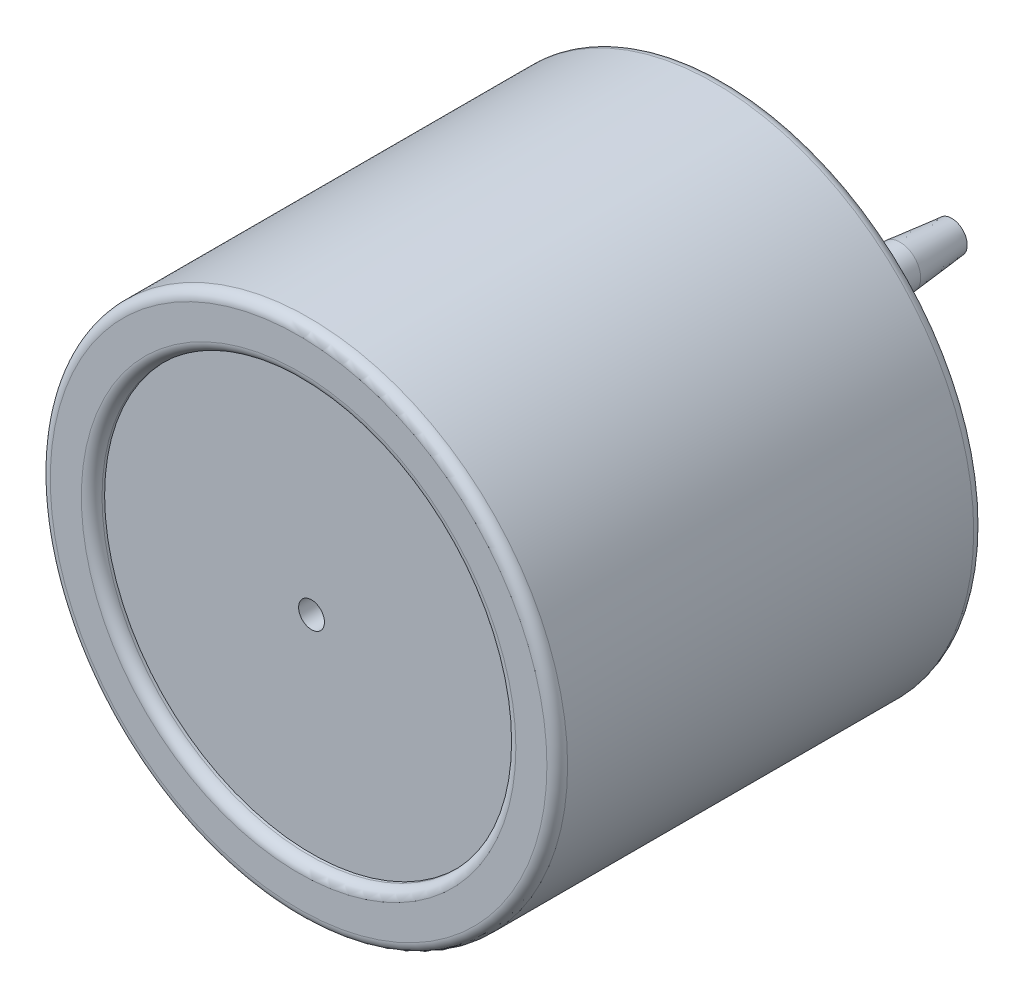
ISO-10303-21;
HEADER;
FILE_DESCRIPTION(('STEP AP214'),'2;1');
FILE_NAME('part.step','',(''),(''),'','','');
FILE_SCHEMA(('AUTOMOTIVE_DESIGN { 1 0 10303 214 1 1 1 1 }'));
ENDSEC;
DATA;
#1=APPLICATION_CONTEXT('core data for automotive mechanical design processes');
#2=APPLICATION_PROTOCOL_DEFINITION('international standard','automotive_design',2000,#1);
#3=PRODUCT_CONTEXT('',#1,'mechanical');
#4=PRODUCT('Part','Part','',(#3));
#5=PRODUCT_RELATED_PRODUCT_CATEGORY('part','',(#4));
#6=PRODUCT_DEFINITION_FORMATION('','',#4);
#7=PRODUCT_DEFINITION_CONTEXT('part definition',#1,'design');
#8=PRODUCT_DEFINITION('design','',#6,#7);
#9=PRODUCT_DEFINITION_SHAPE('','',#8);
#10=(LENGTH_UNIT() NAMED_UNIT(*) SI_UNIT(.MILLI.,.METRE.));
#11=(NAMED_UNIT(*) PLANE_ANGLE_UNIT() SI_UNIT($,.RADIAN.));
#12=(NAMED_UNIT(*) SI_UNIT($,.STERADIAN.) SOLID_ANGLE_UNIT());
#13=UNCERTAINTY_MEASURE_WITH_UNIT(LENGTH_MEASURE(1.E-05),#10,'distance_accuracy_value','');
#14=(GEOMETRIC_REPRESENTATION_CONTEXT(3) GLOBAL_UNCERTAINTY_ASSIGNED_CONTEXT((#13)) GLOBAL_UNIT_ASSIGNED_CONTEXT((#10,
#11,#12)) REPRESENTATION_CONTEXT('',''));
#15=CARTESIAN_POINT('',(0.,0.,0.));
#16=DIRECTION('',(0.,0.,1.));
#17=DIRECTION('',(1.,0.,0.));
#18=AXIS2_PLACEMENT_3D('',#15,#16,#17);
#19=CARTESIAN_POINT('',(0.,0.,16.5));
#20=DIRECTION('',(0.,0.,-1.));
#21=DIRECTION('',(-1.,0.,0.));
#22=AXIS2_PLACEMENT_3D('',#19,#20,#21);
#23=CYLINDRICAL_SURFACE('',#22,10.);
#24=CARTESIAN_POINT('',(0.,0.,0.400000000000001));
#25=DIRECTION('',(0.,0.,1.));
#26=DIRECTION('',(1.,0.,0.));
#27=AXIS2_PLACEMENT_3D('',#24,#25,#26);
#28=CIRCLE('',#27,10.);
#29=CARTESIAN_POINT('',(10.,0.,0.400000000000001));
#30=VERTEX_POINT('',#29);
#31=EDGE_CURVE('E75',#30,#30,#28,.T.);
#32=ORIENTED_EDGE('',*,*,#31,.T.);
#33=EDGE_LOOP('',(#32));
#34=FACE_BOUND('',#33,.T.);
#35=CARTESIAN_POINT('',(0.,0.,16.1));
#36=DIRECTION('',(0.,0.,1.));
#37=DIRECTION('',(1.,0.,0.));
#38=AXIS2_PLACEMENT_3D('',#35,#36,#37);
#39=CIRCLE('',#38,10.);
#40=CARTESIAN_POINT('',(10.,0.,16.1));
#41=VERTEX_POINT('',#40);
#42=EDGE_CURVE('E79',#41,#41,#39,.F.);
#43=ORIENTED_EDGE('',*,*,#42,.T.);
#44=EDGE_LOOP('',(#43));
#45=FACE_BOUND('',#44,.T.);
#46=ADVANCED_FACE('F43',(#34,#45),#23,.T.);
#47=CARTESIAN_POINT('',(0.,0.,16.5));
#48=DIRECTION('',(0.,0.,1.));
#49=DIRECTION('',(1.,0.,0.));
#50=AXIS2_PLACEMENT_3D('',#47,#48,#49);
#51=PLANE('',#50);
#52=CARTESIAN_POINT('',(0.,0.,16.5));
#53=DIRECTION('',(0.,0.,1.));
#54=DIRECTION('',(1.,0.,0.));
#55=AXIS2_PLACEMENT_3D('',#52,#53,#54);
#56=CIRCLE('',#55,9.6);
#57=CARTESIAN_POINT('',(9.6,0.,16.5));
#58=VERTEX_POINT('',#57);
#59=EDGE_CURVE('E51',#58,#58,#56,.T.);
#60=ORIENTED_EDGE('',*,*,#59,.T.);
#61=EDGE_LOOP('',(#60));
#62=FACE_BOUND('',#61,.T.);
#63=CARTESIAN_POINT('',(0.,0.,16.5));
#64=DIRECTION('',(0.,0.,1.));
#65=DIRECTION('',(1.,0.,0.));
#66=AXIS2_PLACEMENT_3D('',#63,#64,#65);
#67=CIRCLE('',#66,8.4);
#68=CARTESIAN_POINT('',(8.4,0.,16.5));
#69=VERTEX_POINT('',#68);
#70=EDGE_CURVE('E56',#69,#69,#67,.F.);
#71=ORIENTED_EDGE('',*,*,#70,.T.);
#72=EDGE_LOOP('',(#71));
#73=FACE_BOUND('',#72,.T.);
#74=ADVANCED_FACE('F148',(#62,#73),#51,.T.);
#75=CARTESIAN_POINT('',(0.,0.,0.));
#76=DIRECTION('',(0.,0.,1.));
#77=DIRECTION('',(1.,0.,0.));
#78=AXIS2_PLACEMENT_3D('',#75,#76,#77);
#79=PLANE('',#78);
#80=CARTESIAN_POINT('',(0.,0.,0.));
#81=DIRECTION('',(0.,0.,1.));
#82=DIRECTION('',(1.,0.,0.));
#83=AXIS2_PLACEMENT_3D('',#80,#81,#82);
#84=CIRCLE('',#83,9.6);
#85=CARTESIAN_POINT('',(9.6,0.,0.));
#86=VERTEX_POINT('',#85);
#87=EDGE_CURVE('E67',#86,#86,#84,.F.);
#88=ORIENTED_EDGE('',*,*,#87,.T.);
#89=EDGE_LOOP('',(#88));
#90=FACE_BOUND('',#89,.T.);
#91=CARTESIAN_POINT('',(0.,0.,0.));
#92=DIRECTION('',(0.,0.,1.));
#93=DIRECTION('',(1.,0.,0.));
#94=AXIS2_PLACEMENT_3D('',#91,#92,#93);
#95=CIRCLE('',#94,9.15);
#96=CARTESIAN_POINT('',(9.15,0.,0.));
#97=VERTEX_POINT('',#96);
#98=EDGE_CURVE('E71',#97,#97,#95,.T.);
#99=ORIENTED_EDGE('',*,*,#98,.T.);
#100=EDGE_LOOP('',(#99));
#101=FACE_BOUND('',#100,.T.);
#102=ADVANCED_FACE('F155',(#90,#101),#79,.F.);
#103=CARTESIAN_POINT('',(0.,0.,16.));
#104=DIRECTION('',(0.,0.,1.));
#105=DIRECTION('',(1.,0.,0.));
#106=AXIS2_PLACEMENT_3D('',#103,#104,#105);
#107=PLANE('',#106);
#108=CARTESIAN_POINT('',(0.,0.,16.));
#109=DIRECTION('',(0.,0.,1.));
#110=DIRECTION('',(1.,0.,0.));
#111=AXIS2_PLACEMENT_3D('',#108,#109,#110);
#112=CIRCLE('',#111,8.);
#113=CARTESIAN_POINT('',(8.,0.,16.));
#114=VERTEX_POINT('',#113);
#115=EDGE_CURVE('E104',#114,#114,#112,.T.);
#116=ORIENTED_EDGE('',*,*,#115,.T.);
#117=EDGE_LOOP('',(#116));
#118=FACE_BOUND('',#117,.T.);
#119=CARTESIAN_POINT('',(0.,0.,16.));
#120=DIRECTION('',(0.,0.,1.));
#121=DIRECTION('',(1.,0.,0.));
#122=AXIS2_PLACEMENT_3D('',#119,#120,#121);
#123=CIRCLE('',#122,0.5);
#124=CARTESIAN_POINT('',(0.5,0.,16.));
#125=VERTEX_POINT('',#124);
#126=EDGE_CURVE('E100',#125,#125,#123,.F.);
#127=ORIENTED_EDGE('',*,*,#126,.T.);
#128=EDGE_LOOP('',(#127));
#129=FACE_BOUND('',#128,.T.);
#130=ADVANCED_FACE('F233',(#118,#129),#107,.T.);
#131=CARTESIAN_POINT('',(0.,0.,16.));
#132=DIRECTION('',(0.,0.,1.));
#133=DIRECTION('',(1.,0.,0.));
#134=AXIS2_PLACEMENT_3D('',#131,#132,#133);
#135=CYLINDRICAL_SURFACE('',#134,8.);
#136=CARTESIAN_POINT('',(0.,0.,16.1));
#137=DIRECTION('',(0.,0.,1.));
#138=DIRECTION('',(1.,0.,0.));
#139=AXIS2_PLACEMENT_3D('',#136,#137,#138);
#140=CIRCLE('',#139,8.);
#141=CARTESIAN_POINT('',(8.,0.,16.1));
#142=VERTEX_POINT('',#141);
#143=EDGE_CURVE('E10',#142,#142,#140,.T.);
#144=ORIENTED_EDGE('',*,*,#143,.T.);
#145=EDGE_LOOP('',(#144));
#146=FACE_BOUND('',#145,.T.);
#147=ORIENTED_EDGE('',*,*,#115,.F.);
#148=EDGE_LOOP('',(#147));
#149=FACE_BOUND('',#148,.T.);
#150=ADVANCED_FACE('F229',(#146,#149),#135,.F.);
#151=CARTESIAN_POINT('',(0.,0.,10.5));
#152=DIRECTION('',(0.,0.,1.));
#153=DIRECTION('',(1.,0.,0.));
#154=AXIS2_PLACEMENT_3D('',#151,#152,#153);
#155=PLANE('',#154);
#156=CARTESIAN_POINT('',(0.,0.,10.5));
#157=DIRECTION('',(0.,0.,1.));
#158=DIRECTION('',(1.,0.,0.));
#159=AXIS2_PLACEMENT_3D('',#156,#157,#158);
#160=CIRCLE('',#159,0.5);
#161=CARTESIAN_POINT('',(0.5,0.,10.5));
#162=VERTEX_POINT('',#161);
#163=EDGE_CURVE('E99',#162,#162,#160,.T.);
#164=ORIENTED_EDGE('',*,*,#163,.T.);
#165=EDGE_LOOP('',(#164));
#166=FACE_BOUND('',#165,.T.);
#167=ADVANCED_FACE('F143',(#166),#155,.T.);
#168=CARTESIAN_POINT('',(0.,0.,10.5));
#169=DIRECTION('',(0.,0.,1.));
#170=DIRECTION('',(1.,0.,0.));
#171=AXIS2_PLACEMENT_3D('',#168,#169,#170);
#172=CYLINDRICAL_SURFACE('',#171,0.5);
#173=ORIENTED_EDGE('',*,*,#163,.F.);
#174=EDGE_LOOP('',(#173));
#175=FACE_BOUND('',#174,.T.);
#176=ORIENTED_EDGE('',*,*,#126,.F.);
#177=EDGE_LOOP('',(#176));
#178=FACE_BOUND('',#177,.T.);
#179=ADVANCED_FACE('F137',(#175,#178),#172,.F.);
#180=CARTESIAN_POINT('',(0.,0.,0.8));
#181=DIRECTION('',(0.,0.,-1.));
#182=DIRECTION('',(-1.,0.,0.));
#183=AXIS2_PLACEMENT_3D('',#180,#181,#182);
#184=CYLINDRICAL_SURFACE('',#183,8.75);
#185=CARTESIAN_POINT('',(0.,0.,0.4));
#186=DIRECTION('',(0.,0.,1.));
#187=DIRECTION('',(1.,0.,0.));
#188=AXIS2_PLACEMENT_3D('',#185,#186,#187);
#189=CIRCLE('',#188,8.75);
#190=CARTESIAN_POINT('',(8.75,0.,0.4));
#191=VERTEX_POINT('',#190);
#192=EDGE_CURVE('E61',#191,#191,#189,.F.);
#193=ORIENTED_EDGE('',*,*,#192,.T.);
#194=EDGE_LOOP('',(#193));
#195=FACE_BOUND('',#194,.T.);
#196=CARTESIAN_POINT('',(0.,0.,0.8));
#197=DIRECTION('',(0.,0.,-1.));
#198=DIRECTION('',(-1.,0.,0.));
#199=AXIS2_PLACEMENT_3D('',#196,#197,#198);
#200=CIRCLE('',#199,8.75);
#201=CARTESIAN_POINT('',(-8.75,0.,0.8));
#202=VERTEX_POINT('',#201);
#203=EDGE_CURVE('E111',#202,#202,#200,.T.);
#204=ORIENTED_EDGE('',*,*,#203,.F.);
#205=EDGE_LOOP('',(#204));
#206=FACE_BOUND('',#205,.T.);
#207=ADVANCED_FACE('F130',(#195,#206),#184,.F.);
#208=CARTESIAN_POINT('',(0.,0.,0.8));
#209=DIRECTION('',(0.,0.,-1.));
#210=DIRECTION('',(-1.,0.,0.));
#211=AXIS2_PLACEMENT_3D('',#208,#209,#210);
#212=PLANE('',#211);
#213=CARTESIAN_POINT('',(-4.7,5.,0.8));
#214=DIRECTION('',(0.,0.,-1.));
#215=DIRECTION('',(1.,0.,0.));
#216=AXIS2_PLACEMENT_3D('',#213,#214,#215);
#217=CIRCLE('',#216,0.800000000000001);
#218=CARTESIAN_POINT('',(-3.9,5.,0.8));
#219=VERTEX_POINT('',#218);
#220=EDGE_CURVE('E119',#219,#219,#217,.T.);
#221=ORIENTED_EDGE('',*,*,#220,.F.);
#222=EDGE_LOOP('',(#221));
#223=FACE_BOUND('',#222,.T.);
#224=CARTESIAN_POINT('',(4.7,5.,0.8));
#225=DIRECTION('',(0.,0.,-1.));
#226=DIRECTION('',(-1.,0.,0.));
#227=AXIS2_PLACEMENT_3D('',#224,#225,#226);
#228=CIRCLE('',#227,0.800000000000001);
#229=CARTESIAN_POINT('',(3.9,5.,0.8));
#230=VERTEX_POINT('',#229);
#231=EDGE_CURVE('E115',#230,#230,#228,.T.);
#232=ORIENTED_EDGE('',*,*,#231,.F.);
#233=EDGE_LOOP('',(#232));
#234=FACE_BOUND('',#233,.T.);
#235=ORIENTED_EDGE('',*,*,#203,.T.);
#236=EDGE_LOOP('',(#235));
#237=FACE_BOUND('',#236,.T.);
#238=ADVANCED_FACE('F126',(#223,#234,#237),#212,.T.);
#239=CARTESIAN_POINT('',(4.7,5.,-4.05));
#240=DIRECTION('',(0.,0.,1.));
#241=DIRECTION('',(1.,0.,0.));
#242=AXIS2_PLACEMENT_3D('',#239,#240,#241);
#243=CYLINDRICAL_SURFACE('',#242,0.800000000000001);
#244=CARTESIAN_POINT('',(4.7,5.,-2.04999999999999));
#245=DIRECTION('',(0.,0.,-1.));
#246=DIRECTION('',(-1.,0.,0.));
#247=AXIS2_PLACEMENT_3D('',#244,#245,#246);
#248=CIRCLE('',#247,0.800000000000001);
#249=CARTESIAN_POINT('',(3.9,5.,-2.04999999999999));
#250=VERTEX_POINT('',#249);
#251=EDGE_CURVE('E83',#250,#250,#248,.F.);
#252=ORIENTED_EDGE('',*,*,#251,.T.);
#253=EDGE_LOOP('',(#252));
#254=FACE_BOUND('',#253,.T.);
#255=ORIENTED_EDGE('',*,*,#231,.T.);
#256=EDGE_LOOP('',(#255));
#257=FACE_BOUND('',#256,.T.);
#258=ADVANCED_FACE('F129',(#254,#257),#243,.T.);
#259=CARTESIAN_POINT('',(4.7,5.,-4.05));
#260=DIRECTION('',(0.,0.,-1.));
#261=DIRECTION('',(-1.,0.,0.));
#262=AXIS2_PLACEMENT_3D('',#259,#260,#261);
#263=PLANE('',#262);
#264=CARTESIAN_POINT('',(4.7,5.,-4.05));
#265=DIRECTION('',(0.,0.,-1.));
#266=DIRECTION('',(-1.,0.,0.));
#267=AXIS2_PLACEMENT_3D('',#264,#265,#266);
#268=CIRCLE('',#267,0.600000000000007);
#269=CARTESIAN_POINT('',(4.09999999999999,5.,-4.05));
#270=VERTEX_POINT('',#269);
#271=EDGE_CURVE('E87',#270,#270,#268,.T.);
#272=ORIENTED_EDGE('',*,*,#271,.T.);
#273=EDGE_LOOP('',(#272));
#274=FACE_BOUND('',#273,.T.);
#275=ADVANCED_FACE('F298',(#274),#263,.T.);
#276=CARTESIAN_POINT('',(-4.7,5.,-4.05));
#277=DIRECTION('',(0.,0.,1.));
#278=DIRECTION('',(1.,0.,0.));
#279=AXIS2_PLACEMENT_3D('',#276,#277,#278);
#280=CYLINDRICAL_SURFACE('',#279,0.800000000000001);
#281=CARTESIAN_POINT('',(-4.7,5.,-2.04999999999999));
#282=DIRECTION('',(0.,0.,1.));
#283=DIRECTION('',(1.,0.,0.));
#284=AXIS2_PLACEMENT_3D('',#281,#282,#283);
#285=CIRCLE('',#284,0.800000000000001);
#286=CARTESIAN_POINT('',(-3.9,5.,-2.04999999999999));
#287=VERTEX_POINT('',#286);
#288=EDGE_CURVE('E91',#287,#287,#285,.T.);
#289=ORIENTED_EDGE('',*,*,#288,.T.);
#290=EDGE_LOOP('',(#289));
#291=FACE_BOUND('',#290,.T.);
#292=ORIENTED_EDGE('',*,*,#220,.T.);
#293=EDGE_LOOP('',(#292));
#294=FACE_BOUND('',#293,.T.);
#295=ADVANCED_FACE('F124',(#291,#294),#280,.T.);
#296=CARTESIAN_POINT('',(-4.7,5.,-4.05));
#297=DIRECTION('',(0.,0.,1.));
#298=DIRECTION('',(1.,0.,0.));
#299=AXIS2_PLACEMENT_3D('',#296,#297,#298);
#300=PLANE('',#299);
#301=CARTESIAN_POINT('',(-4.7,5.,-4.05));
#302=DIRECTION('',(0.,0.,1.));
#303=DIRECTION('',(1.,0.,0.));
#304=AXIS2_PLACEMENT_3D('',#301,#302,#303);
#305=CIRCLE('',#304,0.600000000000007);
#306=CARTESIAN_POINT('',(-4.09999999999999,5.,-4.05));
#307=VERTEX_POINT('',#306);
#308=EDGE_CURVE('E95',#307,#307,#305,.F.);
#309=ORIENTED_EDGE('',*,*,#308,.T.);
#310=EDGE_LOOP('',(#309));
#311=FACE_BOUND('',#310,.T.);
#312=ADVANCED_FACE('F168',(#311),#300,.F.);
#313=CARTESIAN_POINT('',(-4.7,5.,-4.05));
#314=DIRECTION('',(0.,0.,1.));
#315=DIRECTION('',(1.,0.,0.));
#316=AXIS2_PLACEMENT_3D('',#313,#314,#315);
#317=CONICAL_SURFACE('',#316,0.600000000000007,0.0996686524911584);
#318=ORIENTED_EDGE('',*,*,#288,.F.);
#319=EDGE_LOOP('',(#318));
#320=FACE_BOUND('',#319,.T.);
#321=ORIENTED_EDGE('',*,*,#308,.F.);
#322=EDGE_LOOP('',(#321));
#323=FACE_BOUND('',#322,.T.);
#324=ADVANCED_FACE('F161',(#320,#323),#317,.T.);
#325=CARTESIAN_POINT('',(4.7,5.,-4.05));
#326=DIRECTION('',(0.,0.,1.));
#327=DIRECTION('',(1.,0.,0.));
#328=AXIS2_PLACEMENT_3D('',#325,#326,#327);
#329=CONICAL_SURFACE('',#328,0.600000000000007,0.0996686524911584);
#330=ORIENTED_EDGE('',*,*,#251,.F.);
#331=EDGE_LOOP('',(#330));
#332=FACE_BOUND('',#331,.T.);
#333=ORIENTED_EDGE('',*,*,#271,.F.);
#334=EDGE_LOOP('',(#333));
#335=FACE_BOUND('',#334,.T.);
#336=ADVANCED_FACE('F167',(#332,#335),#329,.T.);
#337=CARTESIAN_POINT('',(0.,0.,0.400000000000001));
#338=DIRECTION('',(0.,0.,1.));
#339=DIRECTION('',(1.,0.,0.));
#340=AXIS2_PLACEMENT_3D('',#337,#338,#339);
#341=TOROIDAL_SURFACE('',#340,9.6,0.4);
#342=ORIENTED_EDGE('',*,*,#87,.F.);
#343=EDGE_LOOP('',(#342));
#344=FACE_BOUND('',#343,.T.);
#345=ORIENTED_EDGE('',*,*,#31,.F.);
#346=EDGE_LOOP('',(#345));
#347=FACE_BOUND('',#346,.T.);
#348=ADVANCED_FACE('F174',(#344,#347),#341,.T.);
#349=CARTESIAN_POINT('',(0.,0.,0.4));
#350=DIRECTION('',(0.,0.,1.));
#351=DIRECTION('',(1.,0.,0.));
#352=AXIS2_PLACEMENT_3D('',#349,#350,#351);
#353=TOROIDAL_SURFACE('',#352,9.15,0.4);
#354=ORIENTED_EDGE('',*,*,#98,.F.);
#355=EDGE_LOOP('',(#354));
#356=FACE_BOUND('',#355,.T.);
#357=ORIENTED_EDGE('',*,*,#192,.F.);
#358=EDGE_LOOP('',(#357));
#359=FACE_BOUND('',#358,.T.);
#360=ADVANCED_FACE('F178',(#356,#359),#353,.T.);
#361=CARTESIAN_POINT('',(0.,0.,16.1));
#362=DIRECTION('',(0.,0.,1.));
#363=DIRECTION('',(1.,0.,0.));
#364=AXIS2_PLACEMENT_3D('',#361,#362,#363);
#365=TOROIDAL_SURFACE('',#364,9.6,0.4);
#366=ORIENTED_EDGE('',*,*,#42,.F.);
#367=EDGE_LOOP('',(#366));
#368=FACE_BOUND('',#367,.T.);
#369=ORIENTED_EDGE('',*,*,#59,.F.);
#370=EDGE_LOOP('',(#369));
#371=FACE_BOUND('',#370,.T.);
#372=ADVANCED_FACE('F181',(#368,#371),#365,.T.);
#373=CARTESIAN_POINT('',(0.,0.,16.1));
#374=DIRECTION('',(0.,0.,1.));
#375=DIRECTION('',(1.,0.,0.));
#376=AXIS2_PLACEMENT_3D('',#373,#374,#375);
#377=TOROIDAL_SURFACE('',#376,8.4,0.4);
#378=ORIENTED_EDGE('',*,*,#70,.F.);
#379=EDGE_LOOP('',(#378));
#380=FACE_BOUND('',#379,.T.);
#381=ORIENTED_EDGE('',*,*,#143,.F.);
#382=EDGE_LOOP('',(#381));
#383=FACE_BOUND('',#382,.T.);
#384=ADVANCED_FACE('F45',(#380,#383),#377,.T.);
#385=CLOSED_SHELL('',(#46,#74,#102,#130,#150,#167,#179,#207,#238,#258,#275,#295,#312,#324,#336,
#348,#360,#372,#384));
#386=MANIFOLD_SOLID_BREP('B2',#385);
#387=ADVANCED_BREP_SHAPE_REPRESENTATION('',(#18,#386),#14);
#388=SHAPE_DEFINITION_REPRESENTATION(#9,#387);
ENDSEC;
END-ISO-10303-21;
